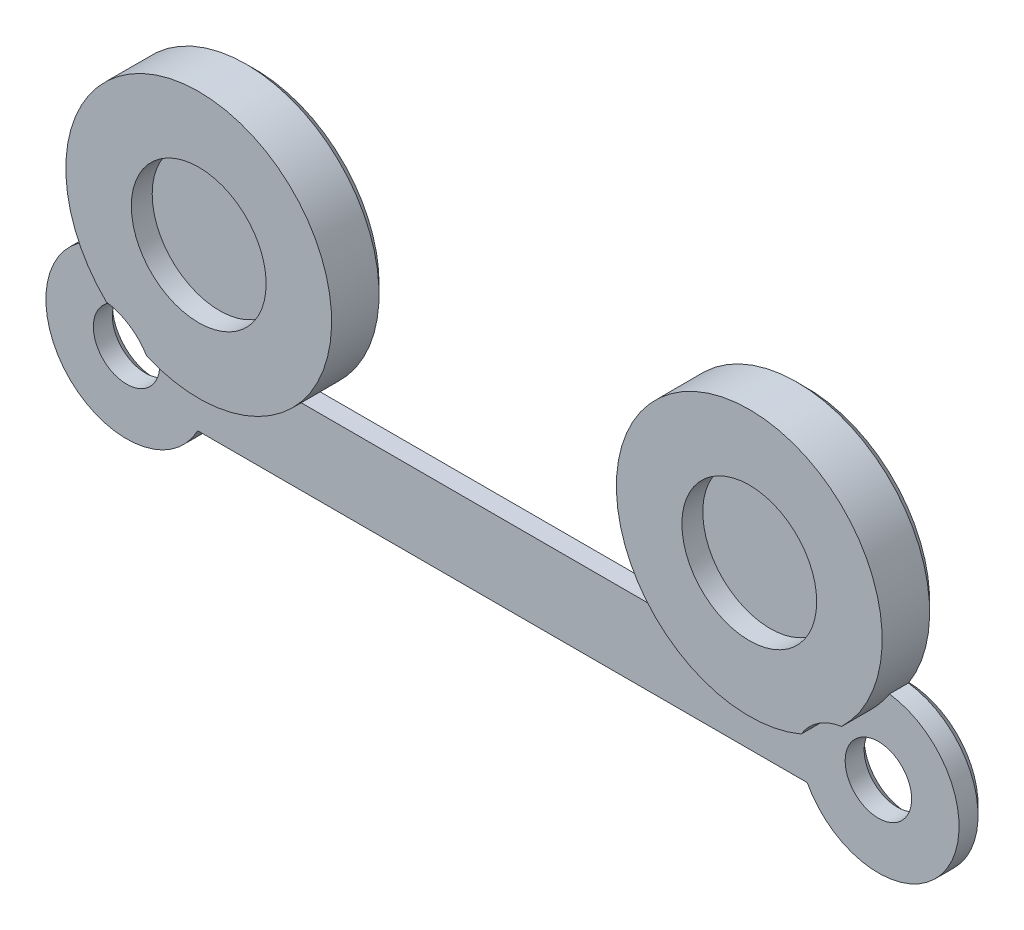
ISO-10303-21;
HEADER;
FILE_DESCRIPTION(('STEP AP214'),'2;1');
FILE_NAME('part.step','',(''),(''),'','','');
FILE_SCHEMA(('AUTOMOTIVE_DESIGN { 1 0 10303 214 1 1 1 1 }'));
ENDSEC;
DATA;
#1=APPLICATION_CONTEXT('core data for automotive mechanical design processes');
#2=APPLICATION_PROTOCOL_DEFINITION('international standard','automotive_design',2000,#1);
#3=PRODUCT_CONTEXT('',#1,'mechanical');
#4=PRODUCT('Part','Part','',(#3));
#5=PRODUCT_RELATED_PRODUCT_CATEGORY('part','',(#4));
#6=PRODUCT_DEFINITION_FORMATION('','',#4);
#7=PRODUCT_DEFINITION_CONTEXT('part definition',#1,'design');
#8=PRODUCT_DEFINITION('design','',#6,#7);
#9=PRODUCT_DEFINITION_SHAPE('','',#8);
#10=(LENGTH_UNIT() NAMED_UNIT(*) SI_UNIT(.MILLI.,.METRE.));
#11=(NAMED_UNIT(*) PLANE_ANGLE_UNIT() SI_UNIT($,.RADIAN.));
#12=(NAMED_UNIT(*) SI_UNIT($,.STERADIAN.) SOLID_ANGLE_UNIT());
#13=UNCERTAINTY_MEASURE_WITH_UNIT(LENGTH_MEASURE(1.E-05),#10,'distance_accuracy_value','');
#14=(GEOMETRIC_REPRESENTATION_CONTEXT(3) GLOBAL_UNCERTAINTY_ASSIGNED_CONTEXT((#13)) GLOBAL_UNIT_ASSIGNED_CONTEXT((#10,
#11,#12)) REPRESENTATION_CONTEXT('',''));
#15=CARTESIAN_POINT('',(0.,0.,0.));
#16=DIRECTION('',(0.,0.,1.));
#17=DIRECTION('',(1.,0.,0.));
#18=AXIS2_PLACEMENT_3D('',#15,#16,#17);
#19=CARTESIAN_POINT('',(5.3,8.,3.));
#20=DIRECTION('',(0.,0.,-1.));
#21=DIRECTION('',(-1.,0.,0.));
#22=AXIS2_PLACEMENT_3D('',#19,#20,#21);
#23=CYLINDRICAL_SURFACE('',#22,3.55);
#24=CARTESIAN_POINT('',(5.3,8.,3.));
#25=DIRECTION('',(0.,0.,1.));
#26=DIRECTION('',(1.,0.,0.));
#27=AXIS2_PLACEMENT_3D('',#24,#25,#26);
#28=CIRCLE('',#27,3.55);
#29=CARTESIAN_POINT('',(8.85,8.,3.));
#30=VERTEX_POINT('',#29);
#31=EDGE_CURVE('E198',#30,#30,#28,.T.);
#32=ORIENTED_EDGE('',*,*,#31,.T.);
#33=EDGE_LOOP('',(#32));
#34=FACE_BOUND('',#33,.T.);
#35=CARTESIAN_POINT('',(5.3,8.,1.9));
#36=DIRECTION('',(0.,0.,-1.));
#37=DIRECTION('',(-1.,0.,0.));
#38=AXIS2_PLACEMENT_3D('',#35,#36,#37);
#39=CIRCLE('',#38,3.55);
#40=CARTESIAN_POINT('',(1.75,8.,1.9));
#41=VERTEX_POINT('',#40);
#42=EDGE_CURVE('E186',#41,#41,#39,.T.);
#43=ORIENTED_EDGE('',*,*,#42,.T.);
#44=EDGE_LOOP('',(#43));
#45=FACE_BOUND('',#44,.T.);
#46=ADVANCED_FACE('F37',(#34,#45),#23,.F.);
#47=CARTESIAN_POINT('',(5.3,8.,1.5));
#48=DIRECTION('',(0.,0.,-1.));
#49=DIRECTION('',(-1.,0.,0.));
#50=AXIS2_PLACEMENT_3D('',#47,#48,#49);
#51=CYLINDRICAL_SURFACE('',#50,7.);
#52=DIRECTION('',(0.,0.,-1.));
#53=VECTOR('',#52,1.);
#54=CARTESIAN_POINT('',(8.90555127546399,2.,1.5));
#55=LINE('',#54,#53);
#56=CARTESIAN_POINT('',(8.90555127546399,2.,1.5));
#57=VERTEX_POINT('',#56);
#58=CARTESIAN_POINT('',(8.90555127546399,2.,0.500000000000002));
#59=VERTEX_POINT('',#58);
#60=EDGE_CURVE('E218',#57,#59,#55,.T.);
#61=ORIENTED_EDGE('',*,*,#60,.T.);
#62=CARTESIAN_POINT('',(5.3,8.,0.500000000000002));
#63=DIRECTION('',(0.,0.,1.));
#64=DIRECTION('',(1.,0.,0.));
#65=AXIS2_PLACEMENT_3D('',#62,#63,#64);
#66=CIRCLE('',#65,7.);
#67=CARTESIAN_POINT('',(-0.584940047051821,4.20955403117183,0.500000000000002));
#68=VERTEX_POINT('',#67);
#69=EDGE_CURVE('E11',#59,#68,#66,.T.);
#70=ORIENTED_EDGE('',*,*,#69,.T.);
#71=DIRECTION('',(0.,0.,-1.));
#72=VECTOR('',#71,1.);
#73=CARTESIAN_POINT('',(-0.584940047051821,4.20955403117183,1.5));
#74=LINE('',#73,#72);
#75=CARTESIAN_POINT('',(-0.584940047051822,4.20955403117183,1.5));
#76=VERTEX_POINT('',#75);
#77=EDGE_CURVE('E225',#76,#68,#74,.T.);
#78=ORIENTED_EDGE('',*,*,#77,.F.);
#79=CARTESIAN_POINT('',(5.3,8.,1.5));
#80=DIRECTION('',(0.,0.,1.));
#81=DIRECTION('',(1.,0.,0.));
#82=AXIS2_PLACEMENT_3D('',#79,#80,#81);
#83=CIRCLE('',#82,7.);
#84=CARTESIAN_POINT('',(0.433339008762328,2.96853790669496,1.5));
#85=VERTEX_POINT('',#84);
#86=EDGE_CURVE('E206',#76,#85,#83,.T.);
#87=ORIENTED_EDGE('',*,*,#86,.T.);
#88=DIRECTION('',(0.,0.,-1.));
#89=VECTOR('',#88,1.);
#90=CARTESIAN_POINT('',(0.433339008762328,2.96853790669496,2.25));
#91=LINE('',#90,#89);
#92=CARTESIAN_POINT('',(0.433339008762328,2.96853790669496,3.));
#93=VERTEX_POINT('',#92);
#94=EDGE_CURVE('E196',#93,#85,#91,.T.);
#95=ORIENTED_EDGE('',*,*,#94,.F.);
#96=CARTESIAN_POINT('',(5.3,8.,3.));
#97=DIRECTION('',(0.,0.,1.));
#98=DIRECTION('',(1.,0.,0.));
#99=AXIS2_PLACEMENT_3D('',#96,#97,#98);
#100=CIRCLE('',#99,7.);
#101=CARTESIAN_POINT('',(2.56456521536624,1.55660054481986,3.));
#102=VERTEX_POINT('',#101);
#103=EDGE_CURVE('E202',#102,#93,#100,.T.);
#104=ORIENTED_EDGE('',*,*,#103,.F.);
#105=DIRECTION('',(0.,0.,-1.));
#106=VECTOR('',#105,1.);
#107=CARTESIAN_POINT('',(2.56456521536624,1.55660054481986,2.25));
#108=LINE('',#107,#106);
#109=CARTESIAN_POINT('',(2.56456521536624,1.55660054481986,1.5));
#110=VERTEX_POINT('',#109);
#111=EDGE_CURVE('E194',#110,#102,#108,.F.);
#112=ORIENTED_EDGE('',*,*,#111,.F.);
#113=EDGE_CURVE('E201',#110,#57,#83,.T.);
#114=ORIENTED_EDGE('',*,*,#113,.T.);
#115=EDGE_LOOP('',(#61,#70,#78,#87,#95,#104,#112,#114));
#116=FACE_BOUND('',#115,.T.);
#117=ADVANCED_FACE('F356',(#116),#51,.T.);
#118=CARTESIAN_POINT('',(0.,0.,1.5));
#119=DIRECTION('',(0.,0.,-1.));
#120=DIRECTION('',(-1.,0.,0.));
#121=AXIS2_PLACEMENT_3D('',#118,#119,#120);
#122=CYLINDRICAL_SURFACE('',#121,4.25);
#123=ORIENTED_EDGE('',*,*,#77,.T.);
#124=CARTESIAN_POINT('',(0.,0.,0.500000000000002));
#125=DIRECTION('',(0.,0.,1.));
#126=DIRECTION('',(1.,0.,0.));
#127=AXIS2_PLACEMENT_3D('',#124,#125,#126);
#128=CIRCLE('',#127,4.25);
#129=CARTESIAN_POINT('',(3.75,-2.,0.500000000000002));
#130=VERTEX_POINT('',#129);
#131=EDGE_CURVE('E265',#68,#130,#128,.T.);
#132=ORIENTED_EDGE('',*,*,#131,.T.);
#133=DIRECTION('',(0.,0.,-1.));
#134=VECTOR('',#133,1.);
#135=CARTESIAN_POINT('',(3.75,-2.,1.5));
#136=LINE('',#135,#134);
#137=CARTESIAN_POINT('',(3.75,-2.,1.5));
#138=VERTEX_POINT('',#137);
#139=EDGE_CURVE('E222',#138,#130,#136,.T.);
#140=ORIENTED_EDGE('',*,*,#139,.F.);
#141=CARTESIAN_POINT('',(0.,0.,1.5));
#142=DIRECTION('',(0.,0.,1.));
#143=DIRECTION('',(1.,0.,0.));
#144=AXIS2_PLACEMENT_3D('',#141,#142,#143);
#145=CIRCLE('',#144,4.25);
#146=EDGE_CURVE('E209',#76,#138,#145,.T.);
#147=ORIENTED_EDGE('',*,*,#146,.F.);
#148=EDGE_LOOP('',(#123,#132,#140,#147));
#149=FACE_BOUND('',#148,.T.);
#150=ADVANCED_FACE('F348',(#149),#122,.T.);
#151=CARTESIAN_POINT('',(0.,-2.,1.5));
#152=DIRECTION('',(0.,1.,0.));
#153=DIRECTION('',(-1.,0.,0.));
#154=AXIS2_PLACEMENT_3D('',#151,#152,#153);
#155=PLANE('',#154);
#156=ORIENTED_EDGE('',*,*,#139,.T.);
#157=DIRECTION('',(1.,0.,0.));
#158=VECTOR('',#157,1.);
#159=CARTESIAN_POINT('',(0.,-2.,0.500000000000002));
#160=LINE('',#159,#158);
#161=CARTESIAN_POINT('',(35.85,-2.,0.500000000000002));
#162=VERTEX_POINT('',#161);
#163=EDGE_CURVE('E268',#130,#162,#160,.T.);
#164=ORIENTED_EDGE('',*,*,#163,.T.);
#165=DIRECTION('',(0.,0.,-1.));
#166=VECTOR('',#165,1.);
#167=CARTESIAN_POINT('',(35.85,-2.,1.5));
#168=LINE('',#167,#166);
#169=CARTESIAN_POINT('',(35.85,-2.,1.5));
#170=VERTEX_POINT('',#169);
#171=EDGE_CURVE('E181',#170,#162,#168,.T.);
#172=ORIENTED_EDGE('',*,*,#171,.F.);
#173=DIRECTION('',(1.,0.,0.));
#174=VECTOR('',#173,1.);
#175=CARTESIAN_POINT('',(0.,-2.,1.5));
#176=LINE('',#175,#174);
#177=EDGE_CURVE('E211',#138,#170,#176,.T.);
#178=ORIENTED_EDGE('',*,*,#177,.F.);
#179=EDGE_LOOP('',(#156,#164,#172,#178));
#180=FACE_BOUND('',#179,.T.);
#181=ADVANCED_FACE('F351',(#180),#155,.F.);
#182=CARTESIAN_POINT('',(0.,0.,1.5));
#183=DIRECTION('',(0.,0.,-1.));
#184=DIRECTION('',(-1.,0.,0.));
#185=AXIS2_PLACEMENT_3D('',#182,#183,#184);
#186=CYLINDRICAL_SURFACE('',#185,1.75);
#187=CARTESIAN_POINT('',(0.,0.,0.500000000000002));
#188=DIRECTION('',(0.,0.,1.));
#189=DIRECTION('',(1.,0.,0.));
#190=AXIS2_PLACEMENT_3D('',#187,#188,#189);
#191=CIRCLE('',#190,1.75);
#192=CARTESIAN_POINT('',(1.75,0.,0.500000000000002));
#193=VERTEX_POINT('',#192);
#194=EDGE_CURVE('E262',#193,#193,#191,.F.);
#195=ORIENTED_EDGE('',*,*,#194,.T.);
#196=EDGE_LOOP('',(#195));
#197=FACE_BOUND('',#196,.T.);
#198=CARTESIAN_POINT('',(0.,0.,1.5));
#199=DIRECTION('',(0.,0.,1.));
#200=DIRECTION('',(1.,0.,0.));
#201=AXIS2_PLACEMENT_3D('',#198,#199,#200);
#202=CIRCLE('',#201,1.75);
#203=CARTESIAN_POINT('',(1.75,0.,1.5));
#204=VERTEX_POINT('',#203);
#205=EDGE_CURVE('E215',#204,#204,#202,.T.);
#206=ORIENTED_EDGE('',*,*,#205,.T.);
#207=EDGE_LOOP('',(#206));
#208=FACE_BOUND('',#207,.T.);
#209=ADVANCED_FACE('F362',(#197,#208),#186,.F.);
#210=CARTESIAN_POINT('',(0.,2.,1.5));
#211=DIRECTION('',(0.,1.,0.));
#212=DIRECTION('',(0.,0.,1.));
#213=AXIS2_PLACEMENT_3D('',#210,#211,#212);
#214=PLANE('',#213);
#215=DIRECTION('',(0.,0.,-1.));
#216=VECTOR('',#215,1.);
#217=CARTESIAN_POINT('',(30.694448724536,2.,1.5));
#218=LINE('',#217,#216);
#219=CARTESIAN_POINT('',(30.694448724536,2.,1.5));
#220=VERTEX_POINT('',#219);
#221=CARTESIAN_POINT('',(30.694448724536,2.,0.500000000000002));
#222=VERTEX_POINT('',#221);
#223=EDGE_CURVE('E163',#220,#222,#218,.T.);
#224=ORIENTED_EDGE('',*,*,#223,.T.);
#225=DIRECTION('',(-1.,0.,0.));
#226=VECTOR('',#225,1.);
#227=CARTESIAN_POINT('',(8.90555127546399,2.,0.500000000000002));
#228=LINE('',#227,#226);
#229=EDGE_CURVE('E50',#222,#59,#228,.T.);
#230=ORIENTED_EDGE('',*,*,#229,.T.);
#231=ORIENTED_EDGE('',*,*,#60,.F.);
#232=DIRECTION('',(1.,0.,0.));
#233=VECTOR('',#232,1.);
#234=CARTESIAN_POINT('',(0.,2.,1.5));
#235=LINE('',#234,#233);
#236=EDGE_CURVE('E213',#57,#220,#235,.T.);
#237=ORIENTED_EDGE('',*,*,#236,.T.);
#238=EDGE_LOOP('',(#224,#230,#231,#237));
#239=FACE_BOUND('',#238,.T.);
#240=ADVANCED_FACE('F359',(#239),#214,.T.);
#241=CARTESIAN_POINT('',(5.3,8.,1.5));
#242=DIRECTION('',(0.,0.,-1.));
#243=DIRECTION('',(-1.,0.,0.));
#244=AXIS2_PLACEMENT_3D('',#241,#242,#243);
#245=CYLINDRICAL_SURFACE('',#244,5.05);
#246=CARTESIAN_POINT('',(5.3,8.,0.500000000000003));
#247=DIRECTION('',(0.,0.,1.));
#248=DIRECTION('',(1.,0.,0.));
#249=AXIS2_PLACEMENT_3D('',#246,#247,#248);
#250=CIRCLE('',#249,5.05);
#251=CARTESIAN_POINT('',(10.35,8.,0.500000000000003));
#252=VERTEX_POINT('',#251);
#253=EDGE_CURVE('E259',#252,#252,#250,.F.);
#254=ORIENTED_EDGE('',*,*,#253,.T.);
#255=EDGE_LOOP('',(#254));
#256=FACE_BOUND('',#255,.T.);
#257=CARTESIAN_POINT('',(5.3,8.,1.5));
#258=DIRECTION('',(0.,0.,1.));
#259=DIRECTION('',(1.,0.,0.));
#260=AXIS2_PLACEMENT_3D('',#257,#258,#259);
#261=CIRCLE('',#260,5.05);
#262=CARTESIAN_POINT('',(10.35,8.,1.5));
#263=VERTEX_POINT('',#262);
#264=EDGE_CURVE('E205',#263,#263,#261,.T.);
#265=ORIENTED_EDGE('',*,*,#264,.T.);
#266=EDGE_LOOP('',(#265));
#267=FACE_BOUND('',#266,.T.);
#268=ADVANCED_FACE('F361',(#256,#267),#245,.F.);
#269=CARTESIAN_POINT('',(0.,0.,1.5));
#270=DIRECTION('',(0.,0.,1.));
#271=DIRECTION('',(1.,0.,0.));
#272=AXIS2_PLACEMENT_3D('',#269,#270,#271);
#273=PLANE('',#272);
#274=ORIENTED_EDGE('',*,*,#113,.F.);
#275=CARTESIAN_POINT('',(0.,0.,1.5));
#276=DIRECTION('',(0.,0.,1.));
#277=DIRECTION('',(1.,0.,0.));
#278=AXIS2_PLACEMENT_3D('',#275,#276,#277);
#279=CIRCLE('',#278,3.);
#280=EDGE_CURVE('E189',#110,#85,#279,.T.);
#281=ORIENTED_EDGE('',*,*,#280,.T.);
#282=ORIENTED_EDGE('',*,*,#86,.F.);
#283=ORIENTED_EDGE('',*,*,#146,.T.);
#284=ORIENTED_EDGE('',*,*,#177,.T.);
#285=CARTESIAN_POINT('',(39.6,0.,1.5));
#286=DIRECTION('',(0.,0.,-1.));
#287=DIRECTION('',(-1.,0.,0.));
#288=AXIS2_PLACEMENT_3D('',#285,#286,#287);
#289=CIRCLE('',#288,4.25);
#290=CARTESIAN_POINT('',(40.1849400470518,4.20955403117183,1.5));
#291=VERTEX_POINT('',#290);
#292=EDGE_CURVE('E171',#291,#170,#289,.T.);
#293=ORIENTED_EDGE('',*,*,#292,.F.);
#294=CARTESIAN_POINT('',(34.3,8.,1.5));
#295=DIRECTION('',(0.,0.,-1.));
#296=DIRECTION('',(-1.,0.,0.));
#297=AXIS2_PLACEMENT_3D('',#294,#295,#296);
#298=CIRCLE('',#297,7.);
#299=CARTESIAN_POINT('',(39.1666609912377,2.96853790669496,1.5));
#300=VERTEX_POINT('',#299);
#301=EDGE_CURVE('E148',#291,#300,#298,.T.);
#302=ORIENTED_EDGE('',*,*,#301,.T.);
#303=CARTESIAN_POINT('',(39.6,0.,1.5));
#304=DIRECTION('',(0.,0.,-1.));
#305=DIRECTION('',(-1.,0.,0.));
#306=AXIS2_PLACEMENT_3D('',#303,#304,#305);
#307=CIRCLE('',#306,3.);
#308=CARTESIAN_POINT('',(37.0354347846338,1.55660054481986,1.5));
#309=VERTEX_POINT('',#308);
#310=EDGE_CURVE('E139',#309,#300,#307,.T.);
#311=ORIENTED_EDGE('',*,*,#310,.F.);
#312=EDGE_CURVE('E146',#309,#220,#298,.T.);
#313=ORIENTED_EDGE('',*,*,#312,.T.);
#314=ORIENTED_EDGE('',*,*,#236,.F.);
#315=EDGE_LOOP('',(#274,#281,#282,#283,#284,#293,#302,#311,#313,#314));
#316=FACE_BOUND('',#315,.T.);
#317=ORIENTED_EDGE('',*,*,#205,.F.);
#318=EDGE_LOOP('',(#317));
#319=FACE_BOUND('',#318,.T.);
#320=CARTESIAN_POINT('',(39.6,0.,1.5));
#321=DIRECTION('',(0.,0.,-1.));
#322=DIRECTION('',(-1.,0.,0.));
#323=AXIS2_PLACEMENT_3D('',#320,#321,#322);
#324=CIRCLE('',#323,1.75);
#325=CARTESIAN_POINT('',(37.85,0.,1.5));
#326=VERTEX_POINT('',#325);
#327=EDGE_CURVE('E174',#326,#326,#324,.T.);
#328=ORIENTED_EDGE('',*,*,#327,.T.);
#329=EDGE_LOOP('',(#328));
#330=FACE_BOUND('',#329,.T.);
#331=ADVANCED_FACE('F142',(#316,#319,#330),#273,.T.);
#332=CARTESIAN_POINT('',(0.,0.,0.));
#333=DIRECTION('',(0.,0.,1.));
#334=DIRECTION('',(1.,0.,0.));
#335=AXIS2_PLACEMENT_3D('',#332,#333,#334);
#336=PLANE('',#335);
#337=CARTESIAN_POINT('',(34.3,8.,0.));
#338=DIRECTION('',(0.,0.,1.));
#339=DIRECTION('',(1.,0.,0.));
#340=AXIS2_PLACEMENT_3D('',#337,#338,#339);
#341=CIRCLE('',#340,5.55);
#342=CARTESIAN_POINT('',(39.85,8.,0.));
#343=VERTEX_POINT('',#342);
#344=EDGE_CURVE('E253',#343,#343,#341,.T.);
#345=ORIENTED_EDGE('',*,*,#344,.T.);
#346=EDGE_LOOP('',(#345));
#347=FACE_BOUND('',#346,.T.);
#348=CARTESIAN_POINT('',(39.6,0.,0.));
#349=DIRECTION('',(0.,0.,1.));
#350=DIRECTION('',(1.,0.,0.));
#351=AXIS2_PLACEMENT_3D('',#348,#349,#350);
#352=CIRCLE('',#351,2.25000000000001);
#353=CARTESIAN_POINT('',(41.85,0.,0.));
#354=VERTEX_POINT('',#353);
#355=EDGE_CURVE('E250',#354,#354,#352,.T.);
#356=ORIENTED_EDGE('',*,*,#355,.T.);
#357=EDGE_LOOP('',(#356));
#358=FACE_BOUND('',#357,.T.);
#359=CARTESIAN_POINT('',(5.3,8.,0.));
#360=DIRECTION('',(0.,0.,1.));
#361=DIRECTION('',(1.,0.,0.));
#362=AXIS2_PLACEMENT_3D('',#359,#360,#361);
#363=CIRCLE('',#362,5.55000000000001);
#364=CARTESIAN_POINT('',(10.85,8.,0.));
#365=VERTEX_POINT('',#364);
#366=EDGE_CURVE('E247',#365,#365,#363,.T.);
#367=ORIENTED_EDGE('',*,*,#366,.T.);
#368=EDGE_LOOP('',(#367));
#369=FACE_BOUND('',#368,.T.);
#370=CARTESIAN_POINT('',(0.,0.,0.));
#371=DIRECTION('',(0.,0.,1.));
#372=DIRECTION('',(1.,0.,0.));
#373=AXIS2_PLACEMENT_3D('',#370,#371,#372);
#374=CIRCLE('',#373,2.25000000000001);
#375=CARTESIAN_POINT('',(2.25000000000001,0.,0.));
#376=VERTEX_POINT('',#375);
#377=EDGE_CURVE('E244',#376,#376,#374,.T.);
#378=ORIENTED_EDGE('',*,*,#377,.T.);
#379=EDGE_LOOP('',(#378));
#380=FACE_BOUND('',#379,.T.);
#381=DIRECTION('',(-1.,0.,0.));
#382=VECTOR('',#381,1.);
#383=CARTESIAN_POINT('',(0.,-1.5,0.));
#384=LINE('',#383,#382);
#385=CARTESIAN_POINT('',(36.1630682287831,-1.49999999999986,0.));
#386=VERTEX_POINT('',#385);
#387=CARTESIAN_POINT('',(3.43693177121694,-1.5,0.));
#388=VERTEX_POINT('',#387);
#389=EDGE_CURVE('E239',#386,#388,#384,.T.);
#390=ORIENTED_EDGE('',*,*,#389,.T.);
#391=CARTESIAN_POINT('',(0.,0.,0.));
#392=DIRECTION('',(0.,0.,1.));
#393=DIRECTION('',(1.,0.,0.));
#394=AXIS2_PLACEMENT_3D('',#391,#392,#393);
#395=CIRCLE('',#394,3.75);
#396=CARTESIAN_POINT('',(0.400541499899828,3.72854750631636,0.));
#397=VERTEX_POINT('',#396);
#398=EDGE_CURVE('E241',#388,#397,#395,.F.);
#399=ORIENTED_EDGE('',*,*,#398,.T.);
#400=CARTESIAN_POINT('',(5.3,8.,0.));
#401=DIRECTION('',(0.,0.,1.));
#402=DIRECTION('',(1.,0.,0.));
#403=AXIS2_PLACEMENT_3D('',#400,#401,#402);
#404=CIRCLE('',#403,6.5);
#405=CARTESIAN_POINT('',(5.30000402922171,1.50000000000125,0.));
#406=VERTEX_POINT('',#405);
#407=EDGE_CURVE('E231',#397,#406,#404,.F.);
#408=ORIENTED_EDGE('',*,*,#407,.T.);
#409=DIRECTION('',(1.,0.,0.));
#410=VECTOR('',#409,1.);
#411=CARTESIAN_POINT('',(30.694448724536,1.5,0.));
#412=LINE('',#411,#410);
#413=CARTESIAN_POINT('',(34.2999959705494,1.5,0.));
#414=VERTEX_POINT('',#413);
#415=EDGE_CURVE('E233',#406,#414,#412,.T.);
#416=ORIENTED_EDGE('',*,*,#415,.T.);
#417=CARTESIAN_POINT('',(34.3,8.,0.));
#418=DIRECTION('',(0.,0.,1.));
#419=DIRECTION('',(1.,0.,0.));
#420=AXIS2_PLACEMENT_3D('',#417,#418,#419);
#421=CIRCLE('',#420,6.5);
#422=CARTESIAN_POINT('',(39.1994585001002,3.72854750631636,0.));
#423=VERTEX_POINT('',#422);
#424=EDGE_CURVE('E235',#414,#423,#421,.F.);
#425=ORIENTED_EDGE('',*,*,#424,.T.);
#426=CARTESIAN_POINT('',(39.6,0.,0.));
#427=DIRECTION('',(0.,0.,1.));
#428=DIRECTION('',(1.,0.,0.));
#429=AXIS2_PLACEMENT_3D('',#426,#427,#428);
#430=CIRCLE('',#429,3.75);
#431=EDGE_CURVE('E237',#423,#386,#430,.F.);
#432=ORIENTED_EDGE('',*,*,#431,.T.);
#433=EDGE_LOOP('',(#390,#399,#408,#416,#425,#432));
#434=FACE_BOUND('',#433,.T.);
#435=ADVANCED_FACE('F335',(#347,#358,#369,#380,#434),#336,.F.);
#436=CARTESIAN_POINT('',(5.3,8.,3.));
#437=DIRECTION('',(0.,0.,1.));
#438=DIRECTION('',(1.,0.,0.));
#439=AXIS2_PLACEMENT_3D('',#436,#437,#438);
#440=PLANE('',#439);
#441=ORIENTED_EDGE('',*,*,#103,.T.);
#442=CARTESIAN_POINT('',(0.,0.,3.));
#443=DIRECTION('',(0.,0.,1.));
#444=DIRECTION('',(1.,0.,0.));
#445=AXIS2_PLACEMENT_3D('',#442,#443,#444);
#446=CIRCLE('',#445,3.);
#447=EDGE_CURVE('E192',#102,#93,#446,.T.);
#448=ORIENTED_EDGE('',*,*,#447,.F.);
#449=EDGE_LOOP('',(#441,#448));
#450=FACE_BOUND('',#449,.T.);
#451=ORIENTED_EDGE('',*,*,#31,.F.);
#452=EDGE_LOOP('',(#451));
#453=FACE_BOUND('',#452,.T.);
#454=ADVANCED_FACE('F386',(#450,#453),#440,.T.);
#455=CARTESIAN_POINT('',(5.3,8.,1.5));
#456=DIRECTION('',(0.,0.,1.));
#457=DIRECTION('',(1.,0.,0.));
#458=AXIS2_PLACEMENT_3D('',#455,#456,#457);
#459=PLANE('',#458);
#460=ORIENTED_EDGE('',*,*,#264,.F.);
#461=EDGE_LOOP('',(#460));
#462=FACE_BOUND('',#461,.T.);
#463=ADVANCED_FACE('F389',(#462),#459,.F.);
#464=CARTESIAN_POINT('',(0.,0.,11.4852813742386));
#465=DIRECTION('',(0.,0.,-1.));
#466=DIRECTION('',(-1.,0.,0.));
#467=AXIS2_PLACEMENT_3D('',#464,#465,#466);
#468=CYLINDRICAL_SURFACE('',#467,3.);
#469=ORIENTED_EDGE('',*,*,#94,.T.);
#470=ORIENTED_EDGE('',*,*,#280,.F.);
#471=ORIENTED_EDGE('',*,*,#111,.T.);
#472=ORIENTED_EDGE('',*,*,#447,.T.);
#473=EDGE_LOOP('',(#469,#470,#471,#472));
#474=FACE_BOUND('',#473,.T.);
#475=ADVANCED_FACE('F384',(#474),#468,.F.);
#476=CARTESIAN_POINT('',(5.3,8.,1.9));
#477=DIRECTION('',(0.,0.,-1.));
#478=DIRECTION('',(-1.,0.,0.));
#479=AXIS2_PLACEMENT_3D('',#476,#477,#478);
#480=PLANE('',#479);
#481=ORIENTED_EDGE('',*,*,#42,.F.);
#482=EDGE_LOOP('',(#481));
#483=FACE_BOUND('',#482,.T.);
#484=ADVANCED_FACE('F484',(#483),#480,.F.);
#485=CARTESIAN_POINT('',(34.3,8.,3.));
#486=DIRECTION('',(0.,0.,-1.));
#487=DIRECTION('',(1.,0.,0.));
#488=AXIS2_PLACEMENT_3D('',#485,#486,#487);
#489=CYLINDRICAL_SURFACE('',#488,3.55);
#490=CARTESIAN_POINT('',(34.3,8.,3.));
#491=DIRECTION('',(0.,0.,-1.));
#492=DIRECTION('',(-1.,0.,0.));
#493=AXIS2_PLACEMENT_3D('',#490,#491,#492);
#494=CIRCLE('',#493,3.55);
#495=CARTESIAN_POINT('',(30.75,8.,3.));
#496=VERTEX_POINT('',#495);
#497=EDGE_CURVE('E164',#496,#496,#494,.T.);
#498=ORIENTED_EDGE('',*,*,#497,.F.);
#499=EDGE_LOOP('',(#498));
#500=FACE_BOUND('',#499,.T.);
#501=CARTESIAN_POINT('',(34.3,8.,1.9));
#502=DIRECTION('',(0.,0.,1.));
#503=DIRECTION('',(1.,0.,0.));
#504=AXIS2_PLACEMENT_3D('',#501,#502,#503);
#505=CIRCLE('',#504,3.55);
#506=CARTESIAN_POINT('',(37.85,8.,1.9));
#507=VERTEX_POINT('',#506);
#508=EDGE_CURVE('E153',#507,#507,#505,.T.);
#509=ORIENTED_EDGE('',*,*,#508,.F.);
#510=EDGE_LOOP('',(#509));
#511=FACE_BOUND('',#510,.T.);
#512=ADVANCED_FACE('F493',(#500,#511),#489,.F.);
#513=CARTESIAN_POINT('',(34.3,8.,1.5));
#514=DIRECTION('',(0.,0.,-1.));
#515=DIRECTION('',(1.,0.,0.));
#516=AXIS2_PLACEMENT_3D('',#513,#514,#515);
#517=CYLINDRICAL_SURFACE('',#516,7.);
#518=DIRECTION('',(0.,0.,-1.));
#519=VECTOR('',#518,1.);
#520=CARTESIAN_POINT('',(40.1849400470518,4.20955403117183,1.5));
#521=LINE('',#520,#519);
#522=CARTESIAN_POINT('',(40.1849400470518,4.20955403117183,0.500000000000002));
#523=VERTEX_POINT('',#522);
#524=EDGE_CURVE('E184',#291,#523,#521,.T.);
#525=ORIENTED_EDGE('',*,*,#524,.T.);
#526=CARTESIAN_POINT('',(34.3,8.,0.500000000000002));
#527=DIRECTION('',(0.,0.,1.));
#528=DIRECTION('',(1.,0.,0.));
#529=AXIS2_PLACEMENT_3D('',#526,#527,#528);
#530=CIRCLE('',#529,7.);
#531=EDGE_CURVE('E65',#523,#222,#530,.T.);
#532=ORIENTED_EDGE('',*,*,#531,.T.);
#533=ORIENTED_EDGE('',*,*,#223,.F.);
#534=ORIENTED_EDGE('',*,*,#312,.F.);
#535=DIRECTION('',(0.,0.,-1.));
#536=VECTOR('',#535,1.);
#537=CARTESIAN_POINT('',(37.0354347846338,1.55660054481986,2.25));
#538=LINE('',#537,#536);
#539=CARTESIAN_POINT('',(37.0354347846338,1.55660054481986,3.));
#540=VERTEX_POINT('',#539);
#541=EDGE_CURVE('E156',#309,#540,#538,.F.);
#542=ORIENTED_EDGE('',*,*,#541,.T.);
#543=CARTESIAN_POINT('',(34.3,8.,3.));
#544=DIRECTION('',(0.,0.,-1.));
#545=DIRECTION('',(-1.,0.,0.));
#546=AXIS2_PLACEMENT_3D('',#543,#544,#545);
#547=CIRCLE('',#546,7.);
#548=CARTESIAN_POINT('',(39.1666609912377,2.96853790669496,3.));
#549=VERTEX_POINT('',#548);
#550=EDGE_CURVE('E166',#540,#549,#547,.T.);
#551=ORIENTED_EDGE('',*,*,#550,.T.);
#552=DIRECTION('',(0.,0.,-1.));
#553=VECTOR('',#552,1.);
#554=CARTESIAN_POINT('',(39.1666609912377,2.96853790669496,2.25));
#555=LINE('',#554,#553);
#556=EDGE_CURVE('E160',#549,#300,#555,.T.);
#557=ORIENTED_EDGE('',*,*,#556,.T.);
#558=ORIENTED_EDGE('',*,*,#301,.F.);
#559=EDGE_LOOP('',(#525,#532,#533,#534,#542,#551,#557,#558));
#560=FACE_BOUND('',#559,.T.);
#561=ADVANCED_FACE('F162',(#560),#517,.T.);
#562=CARTESIAN_POINT('',(39.6,0.,1.5));
#563=DIRECTION('',(0.,0.,-1.));
#564=DIRECTION('',(1.,0.,0.));
#565=AXIS2_PLACEMENT_3D('',#562,#563,#564);
#566=CYLINDRICAL_SURFACE('',#565,4.25);
#567=ORIENTED_EDGE('',*,*,#171,.T.);
#568=CARTESIAN_POINT('',(39.6,0.,0.500000000000002));
#569=DIRECTION('',(0.,0.,1.));
#570=DIRECTION('',(1.,0.,0.));
#571=AXIS2_PLACEMENT_3D('',#568,#569,#570);
#572=CIRCLE('',#571,4.25);
#573=EDGE_CURVE('E270',#162,#523,#572,.T.);
#574=ORIENTED_EDGE('',*,*,#573,.T.);
#575=ORIENTED_EDGE('',*,*,#524,.F.);
#576=ORIENTED_EDGE('',*,*,#292,.T.);
#577=EDGE_LOOP('',(#567,#574,#575,#576));
#578=FACE_BOUND('',#577,.T.);
#579=ADVANCED_FACE('F507',(#578),#566,.T.);
#580=CARTESIAN_POINT('',(39.6,0.,1.5));
#581=DIRECTION('',(0.,0.,-1.));
#582=DIRECTION('',(1.,0.,0.));
#583=AXIS2_PLACEMENT_3D('',#580,#581,#582);
#584=CYLINDRICAL_SURFACE('',#583,1.75);
#585=CARTESIAN_POINT('',(39.6,0.,0.500000000000001));
#586=DIRECTION('',(0.,0.,1.));
#587=DIRECTION('',(1.,0.,0.));
#588=AXIS2_PLACEMENT_3D('',#585,#586,#587);
#589=CIRCLE('',#588,1.75);
#590=CARTESIAN_POINT('',(41.35,0.,0.500000000000001));
#591=VERTEX_POINT('',#590);
#592=EDGE_CURVE('E256',#591,#591,#589,.F.);
#593=ORIENTED_EDGE('',*,*,#592,.T.);
#594=EDGE_LOOP('',(#593));
#595=FACE_BOUND('',#594,.T.);
#596=ORIENTED_EDGE('',*,*,#327,.F.);
#597=EDGE_LOOP('',(#596));
#598=FACE_BOUND('',#597,.T.);
#599=ADVANCED_FACE('F517',(#595,#598),#584,.F.);
#600=CARTESIAN_POINT('',(34.3,8.,1.5));
#601=DIRECTION('',(0.,0.,-1.));
#602=DIRECTION('',(1.,0.,0.));
#603=AXIS2_PLACEMENT_3D('',#600,#601,#602);
#604=CYLINDRICAL_SURFACE('',#603,5.05);
#605=CARTESIAN_POINT('',(34.3,8.,0.499999999999996));
#606=DIRECTION('',(0.,0.,1.));
#607=DIRECTION('',(1.,0.,0.));
#608=AXIS2_PLACEMENT_3D('',#605,#606,#607);
#609=CIRCLE('',#608,5.05);
#610=CARTESIAN_POINT('',(39.35,8.,0.499999999999996));
#611=VERTEX_POINT('',#610);
#612=EDGE_CURVE('E228',#611,#611,#609,.F.);
#613=ORIENTED_EDGE('',*,*,#612,.T.);
#614=EDGE_LOOP('',(#613));
#615=FACE_BOUND('',#614,.T.);
#616=CARTESIAN_POINT('',(34.3,8.,1.5));
#617=DIRECTION('',(0.,0.,-1.));
#618=DIRECTION('',(-1.,0.,0.));
#619=AXIS2_PLACEMENT_3D('',#616,#617,#618);
#620=CIRCLE('',#619,5.05);
#621=CARTESIAN_POINT('',(29.25,8.,1.5));
#622=VERTEX_POINT('',#621);
#623=EDGE_CURVE('E175',#622,#622,#620,.T.);
#624=ORIENTED_EDGE('',*,*,#623,.F.);
#625=EDGE_LOOP('',(#624));
#626=FACE_BOUND('',#625,.T.);
#627=ADVANCED_FACE('F527',(#615,#626),#604,.F.);
#628=CARTESIAN_POINT('',(34.3,8.,3.));
#629=DIRECTION('',(0.,0.,1.));
#630=DIRECTION('',(-1.,0.,0.));
#631=AXIS2_PLACEMENT_3D('',#628,#629,#630);
#632=PLANE('',#631);
#633=ORIENTED_EDGE('',*,*,#550,.F.);
#634=CARTESIAN_POINT('',(39.6,0.,3.));
#635=DIRECTION('',(0.,0.,-1.));
#636=DIRECTION('',(-1.,0.,0.));
#637=AXIS2_PLACEMENT_3D('',#634,#635,#636);
#638=CIRCLE('',#637,3.);
#639=EDGE_CURVE('E152',#540,#549,#638,.T.);
#640=ORIENTED_EDGE('',*,*,#639,.T.);
#641=EDGE_LOOP('',(#633,#640));
#642=FACE_BOUND('',#641,.T.);
#643=ORIENTED_EDGE('',*,*,#497,.T.);
#644=EDGE_LOOP('',(#643));
#645=FACE_BOUND('',#644,.T.);
#646=ADVANCED_FACE('F537',(#642,#645),#632,.T.);
#647=CARTESIAN_POINT('',(34.3,8.,1.5));
#648=DIRECTION('',(0.,0.,1.));
#649=DIRECTION('',(-1.,0.,0.));
#650=AXIS2_PLACEMENT_3D('',#647,#648,#649);
#651=PLANE('',#650);
#652=ORIENTED_EDGE('',*,*,#623,.T.);
#653=EDGE_LOOP('',(#652));
#654=FACE_BOUND('',#653,.T.);
#655=ADVANCED_FACE('F547',(#654),#651,.F.);
#656=CARTESIAN_POINT('',(39.6,0.,11.4852813742386));
#657=DIRECTION('',(0.,0.,-1.));
#658=DIRECTION('',(1.,0.,0.));
#659=AXIS2_PLACEMENT_3D('',#656,#657,#658);
#660=CYLINDRICAL_SURFACE('',#659,3.);
#661=ORIENTED_EDGE('',*,*,#556,.F.);
#662=ORIENTED_EDGE('',*,*,#639,.F.);
#663=ORIENTED_EDGE('',*,*,#541,.F.);
#664=ORIENTED_EDGE('',*,*,#310,.T.);
#665=EDGE_LOOP('',(#661,#662,#663,#664));
#666=FACE_BOUND('',#665,.T.);
#667=ADVANCED_FACE('F157',(#666),#660,.F.);
#668=CARTESIAN_POINT('',(34.3,8.,1.9));
#669=DIRECTION('',(0.,0.,-1.));
#670=DIRECTION('',(1.,0.,0.));
#671=AXIS2_PLACEMENT_3D('',#668,#669,#670);
#672=PLANE('',#671);
#673=ORIENTED_EDGE('',*,*,#508,.T.);
#674=EDGE_LOOP('',(#673));
#675=FACE_BOUND('',#674,.T.);
#676=ADVANCED_FACE('F427',(#675),#672,.F.);
#677=CARTESIAN_POINT('',(34.3,8.,0.499999999999996));
#678=DIRECTION('',(0.,0.,-1.));
#679=DIRECTION('',(-1.,0.,0.));
#680=AXIS2_PLACEMENT_3D('',#677,#678,#679);
#681=CONICAL_SURFACE('',#680,5.05,0.785398163397452);
#682=ORIENTED_EDGE('',*,*,#344,.F.);
#683=EDGE_LOOP('',(#682));
#684=FACE_BOUND('',#683,.T.);
#685=ORIENTED_EDGE('',*,*,#612,.F.);
#686=EDGE_LOOP('',(#685));
#687=FACE_BOUND('',#686,.T.);
#688=ADVANCED_FACE('F424',(#684,#687),#681,.F.);
#689=CARTESIAN_POINT('',(39.6,0.,0.500000000000001));
#690=DIRECTION('',(0.,0.,-1.));
#691=DIRECTION('',(-1.,0.,0.));
#692=AXIS2_PLACEMENT_3D('',#689,#690,#691);
#693=CONICAL_SURFACE('',#692,1.75,0.785398163397456);
#694=ORIENTED_EDGE('',*,*,#355,.F.);
#695=EDGE_LOOP('',(#694));
#696=FACE_BOUND('',#695,.T.);
#697=ORIENTED_EDGE('',*,*,#592,.F.);
#698=EDGE_LOOP('',(#697));
#699=FACE_BOUND('',#698,.T.);
#700=ADVANCED_FACE('F417',(#696,#699),#693,.F.);
#701=CARTESIAN_POINT('',(5.3,8.,0.));
#702=DIRECTION('',(0.,0.,-1.));
#703=DIRECTION('',(-1.,0.,0.));
#704=AXIS2_PLACEMENT_3D('',#701,#702,#703);
#705=CONICAL_SURFACE('',#704,5.55000000000001,0.785398163397452);
#706=ORIENTED_EDGE('',*,*,#253,.F.);
#707=EDGE_LOOP('',(#706));
#708=FACE_BOUND('',#707,.T.);
#709=ORIENTED_EDGE('',*,*,#366,.F.);
#710=EDGE_LOOP('',(#709));
#711=FACE_BOUND('',#710,.T.);
#712=ADVANCED_FACE('F411',(#708,#711),#705,.F.);
#713=CARTESIAN_POINT('',(0.,0.,0.));
#714=DIRECTION('',(0.,0.,-1.));
#715=DIRECTION('',(-1.,0.,0.));
#716=AXIS2_PLACEMENT_3D('',#713,#714,#715);
#717=CONICAL_SURFACE('',#716,2.25000000000001,0.785398163397455);
#718=ORIENTED_EDGE('',*,*,#194,.F.);
#719=EDGE_LOOP('',(#718));
#720=FACE_BOUND('',#719,.T.);
#721=ORIENTED_EDGE('',*,*,#377,.F.);
#722=EDGE_LOOP('',(#721));
#723=FACE_BOUND('',#722,.T.);
#724=ADVANCED_FACE('F409',(#720,#723),#717,.F.);
#725=CARTESIAN_POINT('',(34.3,8.,0.));
#726=DIRECTION('',(0.,0.,1.));
#727=DIRECTION('',(1.,0.,0.));
#728=AXIS2_PLACEMENT_3D('',#725,#726,#727);
#729=CONICAL_SURFACE('',#728,6.5,0.78539816339745);
#730=CARTESIAN_POINT('',(40.1849400470518,4.20955403117183,0.500000000000002));
#731=CARTESIAN_POINT('',(40.1044440481555,4.17260908233814,0.45233847145986));
#732=CARTESIAN_POINT('',(40.0235332341349,4.13497488699161,0.405882561810706));
#733=CARTESIAN_POINT('',(39.8609844081022,4.05822928218672,0.315866583800265));
#734=CARTESIAN_POINT('',(39.7793475871643,4.01912003848329,0.272302510585931));
#735=CARTESIAN_POINT('',(39.6152008651611,3.9392119056444,0.188407032801962));
#736=CARTESIAN_POINT('',(39.5326907504198,3.8984125955219,0.148076441109926));
#737=CARTESIAN_POINT('',(39.3667374077242,3.8149241934261,0.0711144412824984));
#738=CARTESIAN_POINT('',(39.2832930224756,3.77223250366399,0.0344883599287576));
#739=CARTESIAN_POINT('',(39.1994585001002,3.72854750631636,0.));
#740=B_SPLINE_CURVE_WITH_KNOTS('',3,(#730,#731,#732,#733,#734,#735,#736,#737,#738,#739),
.UNSPECIFIED.,.F.,.F.,(4,2,2,2,4),(0.,0.301746822520609,0.603066645691698,0.904461982850672,
1.20628471801433),.UNSPECIFIED.);
#741=EDGE_CURVE('E315',#423,#523,#740,.F.);
#742=ORIENTED_EDGE('',*,*,#741,.F.);
#743=ORIENTED_EDGE('',*,*,#424,.F.);
#744=CARTESIAN_POINT('',(30.694448724536,2.,0.500000000000002));
#745=CARTESIAN_POINT('',(30.8383696295187,1.96008429737444,0.460084297374438));
#746=CARTESIAN_POINT('',(30.983421315203,1.92224481798114,0.422244817981146));
#747=CARTESIAN_POINT('',(31.2756992538547,1.85096195024154,0.350961950241543));
#748=CARTESIAN_POINT('',(31.4229259333227,1.81751943718632,0.317519437186325));
#749=CARTESIAN_POINT('',(31.8649534472807,1.72474187268202,0.22474187268202));
#750=CARTESIAN_POINT('',(32.1627261197705,1.67222183026768,0.17222183026768));
#751=CARTESIAN_POINT('',(32.6136677752832,1.60850075014037,0.108500750140373));
#752=CARTESIAN_POINT('',(32.7647883825169,1.58976343489796,0.0897634348979602));
#753=CARTESIAN_POINT('',(33.0681520243038,1.55747923418318,0.0574792341831819));
#754=CARTESIAN_POINT('',(33.2203950592696,1.54393235061825,0.0439323506182546));
#755=CARTESIAN_POINT('',(33.5269872348327,1.52207131789459,0.0220713178945943));
#756=CARTESIAN_POINT('',(33.6813431035982,1.51380441612999,0.0138044161299941));
#757=CARTESIAN_POINT('',(33.9904627456665,1.50276374478696,0.0027637447869605));
#758=CARTESIAN_POINT('',(34.145226559891,1.49999054905493,-9.45094506779391E-06));
#759=CARTESIAN_POINT('',(34.2999959705493,1.50000000000062,6.28020881587121E-13));
#760=B_SPLINE_CURVE_WITH_KNOTS('',3,(#744,#745,#746,#747,#748,#749,#750,#751,#752,#753,#754,
#755,#756,#757,#758,#759),.UNSPECIFIED.,.F.,.F.,(4,2,2,2,2,2,2,4),(0.,0.463708325005845,
0.927508819744623,1.8466688751991,2.30680733679591,2.76694596748947,3.2311464545859,
3.6953954273014),.UNSPECIFIED.);
#761=EDGE_CURVE('E42',#222,#414,#760,.T.);
#762=ORIENTED_EDGE('',*,*,#761,.F.);
#763=ORIENTED_EDGE('',*,*,#531,.F.);
#764=EDGE_LOOP('',(#742,#743,#762,#763));
#765=FACE_BOUND('',#764,.T.);
#766=ADVANCED_FACE('F39',(#765),#729,.T.);
#767=CARTESIAN_POINT('',(0.,1.5,0.));
#768=DIRECTION('',(0.,0.707106781186547,-0.707106781186548));
#769=DIRECTION('',(-1.,0.,0.));
#770=AXIS2_PLACEMENT_3D('',#767,#768,#769);
#771=PLANE('',#770);
#772=ORIENTED_EDGE('',*,*,#761,.T.);
#773=ORIENTED_EDGE('',*,*,#415,.F.);
#774=CARTESIAN_POINT('',(8.90555127546399,2.,0.500000000000002));
#775=CARTESIAN_POINT('',(8.76163037047234,1.96008429737194,0.460084297371941));
#776=CARTESIAN_POINT('',(8.61657868477884,1.92224481797641,0.422244817976413));
#777=CARTESIAN_POINT('',(8.32430074610861,1.8509619502329,0.350961950232901));
#778=CARTESIAN_POINT('',(8.17707406663123,1.81751943717601,0.317519437176012));
#779=CARTESIAN_POINT('',(7.73504655264522,1.72474187266771,0.224741872667716));
#780=CARTESIAN_POINT('',(7.43727388013645,1.67222183025193,0.172221830251933));
#781=CARTESIAN_POINT('',(6.98633222459498,1.60850075012445,0.108500750124455));
#782=CARTESIAN_POINT('',(6.83521161735165,1.58976343488231,0.0897634348823176));
#783=CARTESIAN_POINT('',(6.53184797554535,1.55747923416877,0.0574792341687751));
#784=CARTESIAN_POINT('',(6.3796049405699,1.54393235060481,0.0439323506048085));
#785=CARTESIAN_POINT('',(6.07301276498711,1.52207131788376,0.0220713178837642));
#786=CARTESIAN_POINT('',(5.91865689621175,1.51380441612083,0.013804416120832));
#787=CARTESIAN_POINT('',(5.60953725412368,1.50276374478184,0.00276374478184692));
#788=CARTESIAN_POINT('',(5.45477343988944,1.4999905490522,-9.45094780080114E-06));
#789=CARTESIAN_POINT('',(5.30000402922136,1.50000000000062,6.27043202195881E-13));
#790=B_SPLINE_CURVE_WITH_KNOTS('',3,(#774,#775,#776,#777,#778,#779,#780,#781,#782,#783,#784,
#785,#786,#787,#788,#789),.UNSPECIFIED.,.F.,.F.,(4,2,2,2,2,2,2,4),(0.,0.463708325034839,
0.927508819802632,1.84666887531348,2.30680733693859,2.76694596766044,3.23114645478598,
3.69539542753058),.UNSPECIFIED.);
#791=EDGE_CURVE('E304',#59,#406,#790,.T.);
#792=ORIENTED_EDGE('',*,*,#791,.F.);
#793=ORIENTED_EDGE('',*,*,#229,.F.);
#794=EDGE_LOOP('',(#772,#773,#792,#793));
#795=FACE_BOUND('',#794,.T.);
#796=ADVANCED_FACE('F311',(#795),#771,.T.);
#797=CARTESIAN_POINT('',(39.6,0.,0.));
#798=DIRECTION('',(0.,0.,1.));
#799=DIRECTION('',(1.,0.,0.));
#800=AXIS2_PLACEMENT_3D('',#797,#798,#799);
#801=CONICAL_SURFACE('',#800,3.74999999999999,0.785398163397452);
#802=ORIENTED_EDGE('',*,*,#741,.T.);
#803=ORIENTED_EDGE('',*,*,#573,.F.);
#804=CARTESIAN_POINT('',(35.85,-2.,0.500000000000002));
#805=CARTESIAN_POINT('',(35.8751712245696,-1.95804859663823,0.458048596638236));
#806=CARTESIAN_POINT('',(35.9005566539138,-1.916161299882,0.416161299882007));
#807=CARTESIAN_POINT('',(35.9517770357151,-1.83252761184789,0.332527611847893));
#808=CARTESIAN_POINT('',(35.9776119588532,-1.79078121159031,0.290781211590309));
#809=CARTESIAN_POINT('',(36.0297559654358,-1.70743614135916,0.207436141359168));
#810=CARTESIAN_POINT('',(36.0560650535718,-1.66583747285217,0.165837472852171));
#811=CARTESIAN_POINT('',(36.1091845810465,-1.58279727161258,0.0827972716125868));
#812=CARTESIAN_POINT('',(36.135995052861,-1.5413557492693,0.0413557492693041));
#813=CARTESIAN_POINT('',(36.1630682287831,-1.50000000000009,0.));
#814=B_SPLINE_CURVE_WITH_KNOTS('',3,(#804,#805,#806,#807,#808,#809,#810,#811,#812,#813),
.UNSPECIFIED.,.F.,.F.,(4,2,2,2,4),(0.,0.193341225562925,0.386669887060906,0.580000462432282,
0.773343603964052),.UNSPECIFIED.);
#815=EDGE_CURVE('E298',#386,#162,#814,.F.);
#816=ORIENTED_EDGE('',*,*,#815,.F.);
#817=ORIENTED_EDGE('',*,*,#431,.F.);
#818=EDGE_LOOP('',(#802,#803,#816,#817));
#819=FACE_BOUND('',#818,.T.);
#820=ADVANCED_FACE('F308',(#819),#801,.T.);
#821=CARTESIAN_POINT('',(5.3,8.,0.500000000000002));
#822=DIRECTION('',(0.,0.,1.));
#823=DIRECTION('',(1.,0.,0.));
#824=AXIS2_PLACEMENT_3D('',#821,#822,#823);
#825=CONICAL_SURFACE('',#824,7.,0.785398163397448);
#826=ORIENTED_EDGE('',*,*,#791,.T.);
#827=ORIENTED_EDGE('',*,*,#407,.F.);
#828=CARTESIAN_POINT('',(0.400541499899828,3.72854750631636,0.));
#829=CARTESIAN_POINT('',(0.316706977524437,3.77223250366399,0.0344883599287553));
#830=CARTESIAN_POINT('',(0.233262592275765,3.8149241934261,0.0711144412824975));
#831=CARTESIAN_POINT('',(0.0673092495802417,3.8984125955219,0.148076441109926));
#832=CARTESIAN_POINT('',(-0.015200865161116,3.9392119056444,0.188407032801962));
#833=CARTESIAN_POINT('',(-0.179347587164339,4.01912003848329,0.272302510585931));
#834=CARTESIAN_POINT('',(-0.260984408102212,4.05822928218672,0.315866583800265));
#835=CARTESIAN_POINT('',(-0.423533234134922,4.13497488699161,0.405882561810705));
#836=CARTESIAN_POINT('',(-0.504444048155502,4.17260908233814,0.452338471459859));
#837=CARTESIAN_POINT('',(-0.584940047051821,4.20955403117183,0.500000000000002));
#838=B_SPLINE_CURVE_WITH_KNOTS('',3,(#828,#829,#830,#831,#832,#833,#834,#835,#836,#837),
.UNSPECIFIED.,.F.,.F.,(4,2,2,2,4),(0.,0.301822735163664,0.603218072322632,0.904537895493722,
1.20628471801433),.UNSPECIFIED.);
#839=EDGE_CURVE('E281',#68,#397,#838,.F.);
#840=ORIENTED_EDGE('',*,*,#839,.F.);
#841=ORIENTED_EDGE('',*,*,#69,.F.);
#842=EDGE_LOOP('',(#826,#827,#840,#841));
#843=FACE_BOUND('',#842,.T.);
#844=ADVANCED_FACE('F293',(#843),#825,.T.);
#845=CARTESIAN_POINT('',(0.,-2.,0.500000000000002));
#846=DIRECTION('',(0.,0.707106781186547,0.707106781186548));
#847=DIRECTION('',(1.,0.,0.));
#848=AXIS2_PLACEMENT_3D('',#845,#846,#847);
#849=PLANE('',#848);
#850=ORIENTED_EDGE('',*,*,#815,.T.);
#851=ORIENTED_EDGE('',*,*,#163,.F.);
#852=CARTESIAN_POINT('',(3.75,-2.,0.500000000000002));
#853=CARTESIAN_POINT('',(3.7248287754304,-1.95804859663822,0.458048596638224));
#854=CARTESIAN_POINT('',(3.69944334608615,-1.91616129988198,0.416161299881984));
#855=CARTESIAN_POINT('',(3.64822296428487,-1.83252761184785,0.332527611847849));
#856=CARTESIAN_POINT('',(3.62238804114681,-1.79078121159025,0.290781211590255));
#857=CARTESIAN_POINT('',(3.57024403456415,-1.70743614135909,0.207436141359091));
#858=CARTESIAN_POINT('',(3.5439349464281,-1.66583747285208,0.165837472852083));
#859=CARTESIAN_POINT('',(3.4908154189534,-1.58279727161247,0.0827972716124754));
#860=CARTESIAN_POINT('',(3.46400494713892,-1.54135574926918,0.0413557492691814));
#861=CARTESIAN_POINT('',(3.43693177121685,-1.49999999999996,0.));
#862=B_SPLINE_CURVE_WITH_KNOTS('',3,(#852,#853,#854,#855,#856,#857,#858,#859,#860,#861),
.UNSPECIFIED.,.F.,.F.,(4,2,2,2,4),(0.,0.193341225562977,0.386669887061008,0.580000462432436,
0.773343603964258),.UNSPECIFIED.);
#863=EDGE_CURVE('E274',#388,#130,#862,.F.);
#864=ORIENTED_EDGE('',*,*,#863,.F.);
#865=ORIENTED_EDGE('',*,*,#389,.F.);
#866=EDGE_LOOP('',(#850,#851,#864,#865));
#867=FACE_BOUND('',#866,.T.);
#868=ADVANCED_FACE('F290',(#867),#849,.F.);
#869=CARTESIAN_POINT('',(0.,0.,0.500000000000002));
#870=DIRECTION('',(0.,0.,1.));
#871=DIRECTION('',(1.,0.,0.));
#872=AXIS2_PLACEMENT_3D('',#869,#870,#871);
#873=CONICAL_SURFACE('',#872,4.25,0.785398163397449);
#874=ORIENTED_EDGE('',*,*,#839,.T.);
#875=ORIENTED_EDGE('',*,*,#398,.F.);
#876=ORIENTED_EDGE('',*,*,#863,.T.);
#877=ORIENTED_EDGE('',*,*,#131,.F.);
#878=EDGE_LOOP('',(#874,#875,#876,#877));
#879=FACE_BOUND('',#878,.T.);
#880=ADVANCED_FACE('F287',(#879),#873,.T.);
#881=CLOSED_SHELL('',(#46,#117,#150,#181,#209,#240,#268,#331,#435,#454,#463,#475,#484,#512,#561,
#579,#599,#627,#646,#655,#667,#676,#688,#700,#712,#724,#766,#796,#820,#844,#868,#880));
#882=MANIFOLD_SOLID_BREP('B2',#881);
#883=ADVANCED_BREP_SHAPE_REPRESENTATION('',(#18,#882),#14);
#884=SHAPE_DEFINITION_REPRESENTATION(#9,#883);
ENDSEC;
END-ISO-10303-21;
